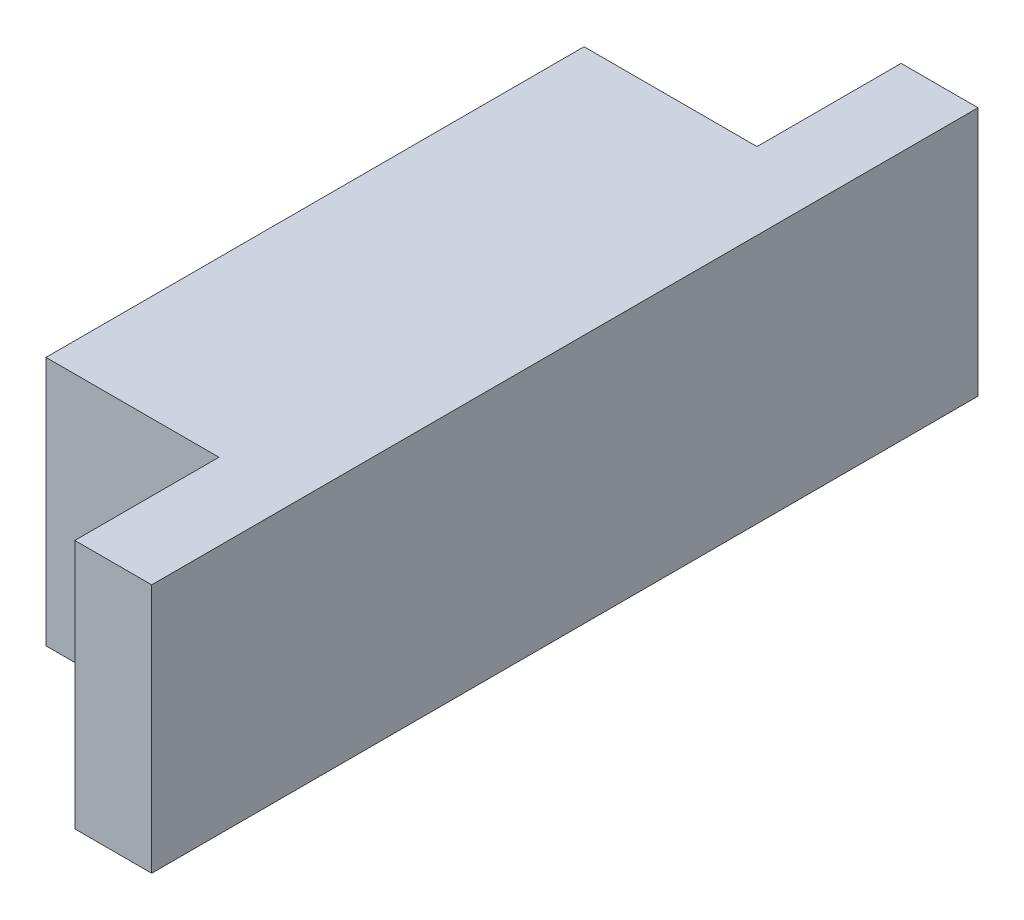
ISO-10303-21;
HEADER;
FILE_DESCRIPTION(('STEP AP214'),'2;1');
FILE_NAME('part.step','',(''),(''),'','','');
FILE_SCHEMA(('AUTOMOTIVE_DESIGN { 1 0 10303 214 1 1 1 1 }'));
ENDSEC;
DATA;
#1=APPLICATION_CONTEXT('core data for automotive mechanical design processes');
#2=APPLICATION_PROTOCOL_DEFINITION('international standard','automotive_design',2000,#1);
#3=PRODUCT_CONTEXT('',#1,'mechanical');
#4=PRODUCT('Part','Part','',(#3));
#5=PRODUCT_RELATED_PRODUCT_CATEGORY('part','',(#4));
#6=PRODUCT_DEFINITION_FORMATION('','',#4);
#7=PRODUCT_DEFINITION_CONTEXT('part definition',#1,'design');
#8=PRODUCT_DEFINITION('design','',#6,#7);
#9=PRODUCT_DEFINITION_SHAPE('','',#8);
#10=(LENGTH_UNIT() NAMED_UNIT(*) SI_UNIT(.MILLI.,.METRE.));
#11=(NAMED_UNIT(*) PLANE_ANGLE_UNIT() SI_UNIT($,.RADIAN.));
#12=(NAMED_UNIT(*) SI_UNIT($,.STERADIAN.) SOLID_ANGLE_UNIT());
#13=UNCERTAINTY_MEASURE_WITH_UNIT(LENGTH_MEASURE(1.E-05),#10,'distance_accuracy_value','');
#14=(GEOMETRIC_REPRESENTATION_CONTEXT(3) GLOBAL_UNCERTAINTY_ASSIGNED_CONTEXT((#13)) GLOBAL_UNIT_ASSIGNED_CONTEXT((#10,
#11,#12)) REPRESENTATION_CONTEXT('',''));
#15=CARTESIAN_POINT('',(0.,0.,0.));
#16=DIRECTION('',(0.,0.,1.));
#17=DIRECTION('',(1.,0.,0.));
#18=AXIS2_PLACEMENT_3D('',#15,#16,#17);
#19=CARTESIAN_POINT('',(9.,0.,0.));
#20=DIRECTION('',(0.,0.,-1.));
#21=DIRECTION('',(-1.,0.,0.));
#22=AXIS2_PLACEMENT_3D('',#19,#20,#21);
#23=PLANE('',#22);
#24=DIRECTION('',(0.,-1.,0.));
#25=VECTOR('',#24,1.);
#26=CARTESIAN_POINT('',(0.,0.,0.));
#27=LINE('',#26,#25);
#28=CARTESIAN_POINT('',(0.,13.,0.));
#29=VERTEX_POINT('',#28);
#30=CARTESIAN_POINT('',(0.,0.,0.));
#31=VERTEX_POINT('',#30);
#32=EDGE_CURVE('E128',#29,#31,#27,.T.);
#33=ORIENTED_EDGE('',*,*,#32,.T.);
#34=DIRECTION('',(-1.,0.,0.));
#35=VECTOR('',#34,1.);
#36=CARTESIAN_POINT('',(9.,0.,0.));
#37=LINE('',#36,#35);
#38=CARTESIAN_POINT('',(9.,0.,0.));
#39=VERTEX_POINT('',#38);
#40=EDGE_CURVE('E11',#39,#31,#37,.T.);
#41=ORIENTED_EDGE('',*,*,#40,.F.);
#42=DIRECTION('',(0.,-1.,0.));
#43=VECTOR('',#42,1.);
#44=CARTESIAN_POINT('',(9.,0.,0.));
#45=LINE('',#44,#43);
#46=CARTESIAN_POINT('',(9.,13.,0.));
#47=VERTEX_POINT('',#46);
#48=EDGE_CURVE('E136',#47,#39,#45,.T.);
#49=ORIENTED_EDGE('',*,*,#48,.F.);
#50=DIRECTION('',(-1.,0.,0.));
#51=VECTOR('',#50,1.);
#52=CARTESIAN_POINT('',(9.,13.,0.));
#53=LINE('',#52,#51);
#54=EDGE_CURVE('E49',#47,#29,#53,.T.);
#55=ORIENTED_EDGE('',*,*,#54,.T.);
#56=EDGE_LOOP('',(#33,#41,#49,#55));
#57=FACE_BOUND('',#56,.T.);
#58=ADVANCED_FACE('F33',(#57),#23,.F.);
#59=CARTESIAN_POINT('',(9.,0.,0.));
#60=DIRECTION('',(0.,1.,0.));
#61=DIRECTION('',(0.,0.,1.));
#62=AXIS2_PLACEMENT_3D('',#59,#60,#61);
#63=PLANE('',#62);
#64=DIRECTION('',(0.,0.,-1.));
#65=VECTOR('',#64,1.);
#66=CARTESIAN_POINT('',(0.,0.,0.));
#67=LINE('',#66,#65);
#68=CARTESIAN_POINT('',(0.,0.,-28.));
#69=VERTEX_POINT('',#68);
#70=EDGE_CURVE('E130',#31,#69,#67,.T.);
#71=ORIENTED_EDGE('',*,*,#70,.T.);
#72=DIRECTION('',(-1.,0.,0.));
#73=VECTOR('',#72,1.);
#74=CARTESIAN_POINT('',(9.,0.,-28.));
#75=LINE('',#74,#73);
#76=CARTESIAN_POINT('',(9.,0.,-28.));
#77=VERTEX_POINT('',#76);
#78=EDGE_CURVE('E41',#77,#69,#75,.T.);
#79=ORIENTED_EDGE('',*,*,#78,.F.);
#80=DIRECTION('',(0.,0.,-1.));
#81=VECTOR('',#80,1.);
#82=CARTESIAN_POINT('',(9.,0.,7.5));
#83=LINE('',#82,#81);
#84=CARTESIAN_POINT('',(9.,0.,-35.5));
#85=VERTEX_POINT('',#84);
#86=EDGE_CURVE('E167',#77,#85,#83,.T.);
#87=ORIENTED_EDGE('',*,*,#86,.T.);
#88=DIRECTION('',(-1.,0.,0.));
#89=VECTOR('',#88,1.);
#90=CARTESIAN_POINT('',(13.,0.,-35.5));
#91=LINE('',#90,#89);
#92=CARTESIAN_POINT('',(13.,0.,-35.5));
#93=VERTEX_POINT('',#92);
#94=EDGE_CURVE('E169',#93,#85,#91,.T.);
#95=ORIENTED_EDGE('',*,*,#94,.F.);
#96=DIRECTION('',(0.,0.,-1.));
#97=VECTOR('',#96,1.);
#98=CARTESIAN_POINT('',(13.,0.,7.5));
#99=LINE('',#98,#97);
#100=CARTESIAN_POINT('',(13.,0.,7.5));
#101=VERTEX_POINT('',#100);
#102=EDGE_CURVE('E119',#101,#93,#99,.T.);
#103=ORIENTED_EDGE('',*,*,#102,.F.);
#104=DIRECTION('',(-1.,0.,0.));
#105=VECTOR('',#104,1.);
#106=CARTESIAN_POINT('',(13.,0.,7.5));
#107=LINE('',#106,#105);
#108=CARTESIAN_POINT('',(9.,0.,7.5));
#109=VERTEX_POINT('',#108);
#110=EDGE_CURVE('E132',#101,#109,#107,.T.);
#111=ORIENTED_EDGE('',*,*,#110,.T.);
#112=EDGE_CURVE('E123',#109,#39,#83,.T.);
#113=ORIENTED_EDGE('',*,*,#112,.T.);
#114=ORIENTED_EDGE('',*,*,#40,.T.);
#115=EDGE_LOOP('',(#71,#79,#87,#95,#103,#111,#113,#114));
#116=FACE_BOUND('',#115,.T.);
#117=ADVANCED_FACE('F172',(#116),#63,.F.);
#118=CARTESIAN_POINT('',(9.,0.,-28.));
#119=DIRECTION('',(0.,0.,1.));
#120=DIRECTION('',(1.,0.,0.));
#121=AXIS2_PLACEMENT_3D('',#118,#119,#120);
#122=PLANE('',#121);
#123=DIRECTION('',(0.,1.,0.));
#124=VECTOR('',#123,1.);
#125=CARTESIAN_POINT('',(0.,0.,-28.));
#126=LINE('',#125,#124);
#127=CARTESIAN_POINT('',(0.,13.,-28.));
#128=VERTEX_POINT('',#127);
#129=EDGE_CURVE('E68',#69,#128,#126,.T.);
#130=ORIENTED_EDGE('',*,*,#129,.T.);
#131=DIRECTION('',(-1.,0.,0.));
#132=VECTOR('',#131,1.);
#133=CARTESIAN_POINT('',(9.,13.,-28.));
#134=LINE('',#133,#132);
#135=CARTESIAN_POINT('',(9.,13.,-28.));
#136=VERTEX_POINT('',#135);
#137=EDGE_CURVE('E145',#136,#128,#134,.T.);
#138=ORIENTED_EDGE('',*,*,#137,.F.);
#139=DIRECTION('',(0.,1.,0.));
#140=VECTOR('',#139,1.);
#141=CARTESIAN_POINT('',(9.,0.,-28.));
#142=LINE('',#141,#140);
#143=EDGE_CURVE('E138',#77,#136,#142,.T.);
#144=ORIENTED_EDGE('',*,*,#143,.F.);
#145=ORIENTED_EDGE('',*,*,#78,.T.);
#146=EDGE_LOOP('',(#130,#138,#144,#145));
#147=FACE_BOUND('',#146,.T.);
#148=ADVANCED_FACE('F147',(#147),#122,.F.);
#149=CARTESIAN_POINT('',(9.,13.,0.));
#150=DIRECTION('',(0.,-1.,0.));
#151=DIRECTION('',(0.,0.,-1.));
#152=AXIS2_PLACEMENT_3D('',#149,#150,#151);
#153=PLANE('',#152);
#154=DIRECTION('',(0.,0.,1.));
#155=VECTOR('',#154,1.);
#156=CARTESIAN_POINT('',(0.,13.,0.));
#157=LINE('',#156,#155);
#158=EDGE_CURVE('E71',#128,#29,#157,.T.);
#159=ORIENTED_EDGE('',*,*,#158,.T.);
#160=ORIENTED_EDGE('',*,*,#54,.F.);
#161=DIRECTION('',(0.,0.,1.));
#162=VECTOR('',#161,1.);
#163=CARTESIAN_POINT('',(9.,13.,7.5));
#164=LINE('',#163,#162);
#165=CARTESIAN_POINT('',(9.,13.,7.5));
#166=VERTEX_POINT('',#165);
#167=EDGE_CURVE('E158',#47,#166,#164,.T.);
#168=ORIENTED_EDGE('',*,*,#167,.T.);
#169=DIRECTION('',(-1.,0.,0.));
#170=VECTOR('',#169,1.);
#171=CARTESIAN_POINT('',(13.,13.,7.5));
#172=LINE('',#171,#170);
#173=CARTESIAN_POINT('',(13.,13.,7.5));
#174=VERTEX_POINT('',#173);
#175=EDGE_CURVE('E110',#174,#166,#172,.T.);
#176=ORIENTED_EDGE('',*,*,#175,.F.);
#177=DIRECTION('',(0.,0.,1.));
#178=VECTOR('',#177,1.);
#179=CARTESIAN_POINT('',(13.,13.,7.5));
#180=LINE('',#179,#178);
#181=CARTESIAN_POINT('',(13.,13.,-35.5));
#182=VERTEX_POINT('',#181);
#183=EDGE_CURVE('E102',#182,#174,#180,.T.);
#184=ORIENTED_EDGE('',*,*,#183,.F.);
#185=DIRECTION('',(-1.,0.,0.));
#186=VECTOR('',#185,1.);
#187=CARTESIAN_POINT('',(13.,13.,-35.5));
#188=LINE('',#187,#186);
#189=CARTESIAN_POINT('',(9.,13.,-35.5));
#190=VERTEX_POINT('',#189);
#191=EDGE_CURVE('E107',#182,#190,#188,.T.);
#192=ORIENTED_EDGE('',*,*,#191,.T.);
#193=EDGE_CURVE('E161',#190,#136,#164,.T.);
#194=ORIENTED_EDGE('',*,*,#193,.T.);
#195=ORIENTED_EDGE('',*,*,#137,.T.);
#196=EDGE_LOOP('',(#159,#160,#168,#176,#184,#192,#194,#195));
#197=FACE_BOUND('',#196,.T.);
#198=ADVANCED_FACE('F104',(#197),#153,.F.);
#199=CARTESIAN_POINT('',(0.,0.,0.));
#200=DIRECTION('',(-1.,0.,0.));
#201=DIRECTION('',(0.,0.,1.));
#202=AXIS2_PLACEMENT_3D('',#199,#200,#201);
#203=PLANE('',#202);
#204=ORIENTED_EDGE('',*,*,#32,.F.);
#205=ORIENTED_EDGE('',*,*,#158,.F.);
#206=ORIENTED_EDGE('',*,*,#129,.F.);
#207=ORIENTED_EDGE('',*,*,#70,.F.);
#208=EDGE_LOOP('',(#204,#205,#206,#207));
#209=FACE_BOUND('',#208,.T.);
#210=ADVANCED_FACE('F152',(#209),#203,.T.);
#211=CARTESIAN_POINT('',(9.,0.,0.));
#212=DIRECTION('',(1.,0.,0.));
#213=DIRECTION('',(0.,0.,-1.));
#214=AXIS2_PLACEMENT_3D('',#211,#212,#213);
#215=PLANE('',#214);
#216=ORIENTED_EDGE('',*,*,#167,.F.);
#217=ORIENTED_EDGE('',*,*,#48,.T.);
#218=ORIENTED_EDGE('',*,*,#112,.F.);
#219=DIRECTION('',(0.,-1.,0.));
#220=VECTOR('',#219,1.);
#221=CARTESIAN_POINT('',(9.,13.,7.5));
#222=LINE('',#221,#220);
#223=EDGE_CURVE('E160',#166,#109,#222,.T.);
#224=ORIENTED_EDGE('',*,*,#223,.F.);
#225=EDGE_LOOP('',(#216,#217,#218,#224));
#226=FACE_BOUND('',#225,.T.);
#227=ADVANCED_FACE('F159',(#226),#215,.F.);
#228=ORIENTED_EDGE('',*,*,#86,.F.);
#229=ORIENTED_EDGE('',*,*,#143,.T.);
#230=ORIENTED_EDGE('',*,*,#193,.F.);
#231=DIRECTION('',(0.,1.,0.));
#232=VECTOR('',#231,1.);
#233=CARTESIAN_POINT('',(9.,13.,-35.5));
#234=LINE('',#233,#232);
#235=EDGE_CURVE('E127',#85,#190,#234,.T.);
#236=ORIENTED_EDGE('',*,*,#235,.F.);
#237=EDGE_LOOP('',(#228,#229,#230,#236));
#238=FACE_BOUND('',#237,.T.);
#239=ADVANCED_FACE('F183',(#238),#215,.F.);
#240=CARTESIAN_POINT('',(13.,13.,-35.5));
#241=DIRECTION('',(0.,0.,1.));
#242=DIRECTION('',(1.,0.,0.));
#243=AXIS2_PLACEMENT_3D('',#240,#241,#242);
#244=PLANE('',#243);
#245=ORIENTED_EDGE('',*,*,#235,.T.);
#246=ORIENTED_EDGE('',*,*,#191,.F.);
#247=DIRECTION('',(0.,1.,0.));
#248=VECTOR('',#247,1.);
#249=CARTESIAN_POINT('',(13.,13.,-35.5));
#250=LINE('',#249,#248);
#251=EDGE_CURVE('E114',#93,#182,#250,.T.);
#252=ORIENTED_EDGE('',*,*,#251,.F.);
#253=ORIENTED_EDGE('',*,*,#94,.T.);
#254=EDGE_LOOP('',(#245,#246,#252,#253));
#255=FACE_BOUND('',#254,.T.);
#256=ADVANCED_FACE('F125',(#255),#244,.F.);
#257=CARTESIAN_POINT('',(13.,13.,7.5));
#258=DIRECTION('',(0.,0.,-1.));
#259=DIRECTION('',(0.,1.,0.));
#260=AXIS2_PLACEMENT_3D('',#257,#258,#259);
#261=PLANE('',#260);
#262=ORIENTED_EDGE('',*,*,#223,.T.);
#263=ORIENTED_EDGE('',*,*,#110,.F.);
#264=DIRECTION('',(0.,-1.,0.));
#265=VECTOR('',#264,1.);
#266=CARTESIAN_POINT('',(13.,13.,7.5));
#267=LINE('',#266,#265);
#268=EDGE_CURVE('E113',#174,#101,#267,.T.);
#269=ORIENTED_EDGE('',*,*,#268,.F.);
#270=ORIENTED_EDGE('',*,*,#175,.T.);
#271=EDGE_LOOP('',(#262,#263,#269,#270));
#272=FACE_BOUND('',#271,.T.);
#273=ADVANCED_FACE('F174',(#272),#261,.F.);
#274=CARTESIAN_POINT('',(13.,0.,0.));
#275=DIRECTION('',(1.,0.,0.));
#276=DIRECTION('',(0.,0.,-1.));
#277=AXIS2_PLACEMENT_3D('',#274,#275,#276);
#278=PLANE('',#277);
#279=ORIENTED_EDGE('',*,*,#251,.T.);
#280=ORIENTED_EDGE('',*,*,#183,.T.);
#281=ORIENTED_EDGE('',*,*,#268,.T.);
#282=ORIENTED_EDGE('',*,*,#102,.T.);
#283=EDGE_LOOP('',(#279,#280,#281,#282));
#284=FACE_BOUND('',#283,.T.);
#285=ADVANCED_FACE('F117',(#284),#278,.T.);
#286=CLOSED_SHELL('',(#58,#117,#148,#198,#210,#227,#239,#256,#273,#285));
#287=MANIFOLD_SOLID_BREP('B2',#286);
#288=ADVANCED_BREP_SHAPE_REPRESENTATION('',(#18,#287),#14);
#289=SHAPE_DEFINITION_REPRESENTATION(#9,#288);
ENDSEC;
END-ISO-10303-21;
